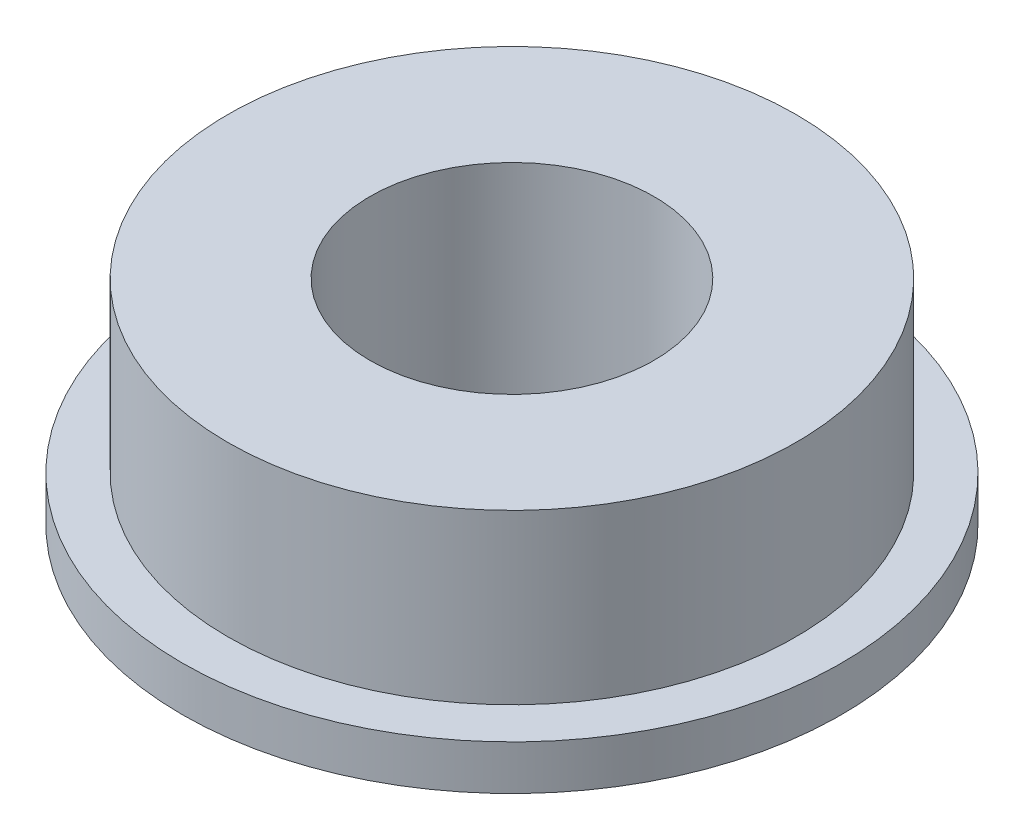
ISO-10303-21;
HEADER;
FILE_DESCRIPTION(('STEP AP214'),'2;1');
FILE_NAME('part.step','',(''),(''),'','','');
FILE_SCHEMA(('AUTOMOTIVE_DESIGN { 1 0 10303 214 1 1 1 1 }'));
ENDSEC;
DATA;
#1=APPLICATION_CONTEXT('core data for automotive mechanical design processes');
#2=APPLICATION_PROTOCOL_DEFINITION('international standard','automotive_design',2000,#1);
#3=PRODUCT_CONTEXT('',#1,'mechanical');
#4=PRODUCT('Part','Part','',(#3));
#5=PRODUCT_RELATED_PRODUCT_CATEGORY('part','',(#4));
#6=PRODUCT_DEFINITION_FORMATION('','',#4);
#7=PRODUCT_DEFINITION_CONTEXT('part definition',#1,'design');
#8=PRODUCT_DEFINITION('design','',#6,#7);
#9=PRODUCT_DEFINITION_SHAPE('','',#8);
#10=(LENGTH_UNIT() NAMED_UNIT(*) SI_UNIT(.MILLI.,.METRE.));
#11=(NAMED_UNIT(*) PLANE_ANGLE_UNIT() SI_UNIT($,.RADIAN.));
#12=(NAMED_UNIT(*) SI_UNIT($,.STERADIAN.) SOLID_ANGLE_UNIT());
#13=UNCERTAINTY_MEASURE_WITH_UNIT(LENGTH_MEASURE(1.E-05),#10,'distance_accuracy_value','');
#14=(GEOMETRIC_REPRESENTATION_CONTEXT(3) GLOBAL_UNCERTAINTY_ASSIGNED_CONTEXT((#13)) GLOBAL_UNIT_ASSIGNED_CONTEXT((#10,
#11,#12)) REPRESENTATION_CONTEXT('',''));
#15=CARTESIAN_POINT('',(0.,0.,0.));
#16=DIRECTION('',(0.,0.,1.));
#17=DIRECTION('',(1.,0.,0.));
#18=AXIS2_PLACEMENT_3D('',#15,#16,#17);
#19=CARTESIAN_POINT('',(0.,9.58557308201758,0.));
#20=DIRECTION('',(0.,1.,0.));
#21=DIRECTION('',(0.,0.,1.));
#22=AXIS2_PLACEMENT_3D('',#19,#20,#21);
#23=CYLINDRICAL_SURFACE('',#22,6.35);
#24=CARTESIAN_POINT('',(0.,4.7625,0.));
#25=DIRECTION('',(0.,1.,0.));
#26=DIRECTION('',(0.,0.,1.));
#27=AXIS2_PLACEMENT_3D('',#24,#25,#26);
#28=CIRCLE('',#27,6.35);
#29=CARTESIAN_POINT('',(0.,4.7625,6.35));
#30=VERTEX_POINT('',#29);
#31=EDGE_CURVE('E48',#30,#30,#28,.F.);
#32=ORIENTED_EDGE('',*,*,#31,.T.);
#33=EDGE_LOOP('',(#32));
#34=FACE_BOUND('',#33,.T.);
#35=CARTESIAN_POINT('',(0.,0.999999999999999,0.));
#36=DIRECTION('',(0.,1.,0.));
#37=DIRECTION('',(0.,0.,1.));
#38=AXIS2_PLACEMENT_3D('',#35,#36,#37);
#39=CIRCLE('',#38,6.35);
#40=CARTESIAN_POINT('',(0.,0.999999999999999,6.35));
#41=VERTEX_POINT('',#40);
#42=EDGE_CURVE('E26',#41,#41,#39,.T.);
#43=ORIENTED_EDGE('',*,*,#42,.T.);
#44=EDGE_LOOP('',(#43));
#45=FACE_BOUND('',#44,.T.);
#46=ADVANCED_FACE('F23',(#34,#45),#23,.T.);
#47=CARTESIAN_POINT('',(0.,1.,-6.35));
#48=DIRECTION('',(0.,-1.,0.));
#49=DIRECTION('',(0.,0.,-1.));
#50=AXIS2_PLACEMENT_3D('',#47,#48,#49);
#51=PLANE('',#50);
#52=CARTESIAN_POINT('',(0.,0.999999999999999,0.));
#53=DIRECTION('',(0.,1.,0.));
#54=DIRECTION('',(0.,0.,1.));
#55=AXIS2_PLACEMENT_3D('',#52,#53,#54);
#56=CIRCLE('',#55,7.366);
#57=CARTESIAN_POINT('',(0.,0.999999999999999,7.366));
#58=VERTEX_POINT('',#57);
#59=EDGE_CURVE('E45',#58,#58,#56,.F.);
#60=ORIENTED_EDGE('',*,*,#59,.F.);
#61=EDGE_LOOP('',(#60));
#62=FACE_BOUND('',#61,.T.);
#63=ORIENTED_EDGE('',*,*,#42,.F.);
#64=EDGE_LOOP('',(#63));
#65=FACE_BOUND('',#64,.T.);
#66=ADVANCED_FACE('F62',(#62,#65),#51,.F.);
#67=CARTESIAN_POINT('',(0.,4.7625,-3.175));
#68=DIRECTION('',(0.,-1.,0.));
#69=DIRECTION('',(0.,0.,-1.));
#70=AXIS2_PLACEMENT_3D('',#67,#68,#69);
#71=PLANE('',#70);
#72=ORIENTED_EDGE('',*,*,#31,.F.);
#73=EDGE_LOOP('',(#72));
#74=FACE_BOUND('',#73,.T.);
#75=CARTESIAN_POINT('',(0.,4.7625,0.));
#76=DIRECTION('',(0.,1.,0.));
#77=DIRECTION('',(0.,0.,1.));
#78=AXIS2_PLACEMENT_3D('',#75,#76,#77);
#79=CIRCLE('',#78,3.175);
#80=CARTESIAN_POINT('',(0.,4.7625,3.175));
#81=VERTEX_POINT('',#80);
#82=EDGE_CURVE('E39',#81,#81,#79,.F.);
#83=ORIENTED_EDGE('',*,*,#82,.T.);
#84=EDGE_LOOP('',(#83));
#85=FACE_BOUND('',#84,.T.);
#86=ADVANCED_FACE('F64',(#74,#85),#71,.F.);
#87=CARTESIAN_POINT('',(0.,9.58557308201758,0.));
#88=DIRECTION('',(0.,1.,0.));
#89=DIRECTION('',(0.,0.,1.));
#90=AXIS2_PLACEMENT_3D('',#87,#88,#89);
#91=CYLINDRICAL_SURFACE('',#90,7.366);
#92=ORIENTED_EDGE('',*,*,#59,.T.);
#93=EDGE_LOOP('',(#92));
#94=FACE_BOUND('',#93,.T.);
#95=CARTESIAN_POINT('',(0.,0.,0.));
#96=DIRECTION('',(0.,1.,0.));
#97=DIRECTION('',(0.,0.,1.));
#98=AXIS2_PLACEMENT_3D('',#95,#96,#97);
#99=CIRCLE('',#98,7.366);
#100=CARTESIAN_POINT('',(0.,0.,7.366));
#101=VERTEX_POINT('',#100);
#102=EDGE_CURVE('E31',#101,#101,#99,.T.);
#103=ORIENTED_EDGE('',*,*,#102,.T.);
#104=EDGE_LOOP('',(#103));
#105=FACE_BOUND('',#104,.T.);
#106=ADVANCED_FACE('F71',(#94,#105),#91,.T.);
#107=CARTESIAN_POINT('',(0.,9.58557308201758,0.));
#108=DIRECTION('',(0.,1.,0.));
#109=DIRECTION('',(0.,0.,1.));
#110=AXIS2_PLACEMENT_3D('',#107,#108,#109);
#111=CYLINDRICAL_SURFACE('',#110,3.175);
#112=CARTESIAN_POINT('',(0.,0.,0.));
#113=DIRECTION('',(0.,1.,0.));
#114=DIRECTION('',(0.,0.,1.));
#115=AXIS2_PLACEMENT_3D('',#112,#113,#114);
#116=CIRCLE('',#115,3.175);
#117=CARTESIAN_POINT('',(0.,0.,3.175));
#118=VERTEX_POINT('',#117);
#119=EDGE_CURVE('E12',#118,#118,#116,.F.);
#120=ORIENTED_EDGE('',*,*,#119,.T.);
#121=EDGE_LOOP('',(#120));
#122=FACE_BOUND('',#121,.T.);
#123=ORIENTED_EDGE('',*,*,#82,.F.);
#124=EDGE_LOOP('',(#123));
#125=FACE_BOUND('',#124,.T.);
#126=ADVANCED_FACE('F77',(#122,#125),#111,.F.);
#127=CARTESIAN_POINT('',(0.,0.,-7.366));
#128=DIRECTION('',(0.,1.,0.));
#129=DIRECTION('',(0.,0.,1.));
#130=AXIS2_PLACEMENT_3D('',#127,#128,#129);
#131=PLANE('',#130);
#132=ORIENTED_EDGE('',*,*,#119,.F.);
#133=EDGE_LOOP('',(#132));
#134=FACE_BOUND('',#133,.T.);
#135=ORIENTED_EDGE('',*,*,#102,.F.);
#136=EDGE_LOOP('',(#135));
#137=FACE_BOUND('',#136,.T.);
#138=ADVANCED_FACE('F75',(#134,#137),#131,.F.);
#139=CLOSED_SHELL('',(#46,#66,#86,#106,#126,#138));
#140=MANIFOLD_SOLID_BREP('B1',#139);
#141=ADVANCED_BREP_SHAPE_REPRESENTATION('',(#18,#140),#14);
#142=SHAPE_DEFINITION_REPRESENTATION(#9,#141);
ENDSEC;
END-ISO-10303-21;
